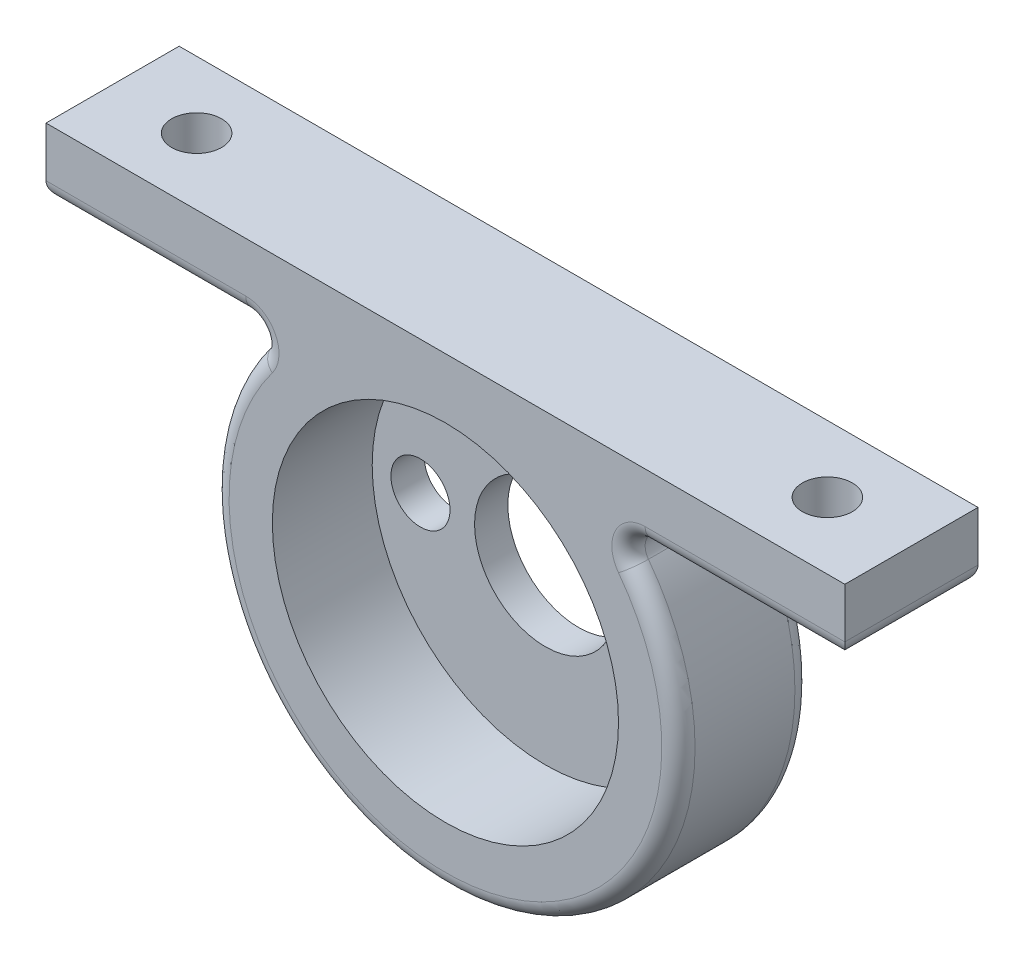
ISO-10303-21;
HEADER;
FILE_DESCRIPTION(('STEP AP214'),'2;1');
FILE_NAME('part.step','',(''),(''),'','','');
FILE_SCHEMA(('AUTOMOTIVE_DESIGN { 1 0 10303 214 1 1 1 1 }'));
ENDSEC;
DATA;
#1=APPLICATION_CONTEXT('core data for automotive mechanical design processes');
#2=APPLICATION_PROTOCOL_DEFINITION('international standard','automotive_design',2000,#1);
#3=PRODUCT_CONTEXT('',#1,'mechanical');
#4=PRODUCT('Part','Part','',(#3));
#5=PRODUCT_RELATED_PRODUCT_CATEGORY('part','',(#4));
#6=PRODUCT_DEFINITION_FORMATION('','',#4);
#7=PRODUCT_DEFINITION_CONTEXT('part definition',#1,'design');
#8=PRODUCT_DEFINITION('design','',#6,#7);
#9=PRODUCT_DEFINITION_SHAPE('','',#8);
#10=(LENGTH_UNIT() NAMED_UNIT(*) SI_UNIT(.MILLI.,.METRE.));
#11=(NAMED_UNIT(*) PLANE_ANGLE_UNIT() SI_UNIT($,.RADIAN.));
#12=(NAMED_UNIT(*) SI_UNIT($,.STERADIAN.) SOLID_ANGLE_UNIT());
#13=UNCERTAINTY_MEASURE_WITH_UNIT(LENGTH_MEASURE(1.E-05),#10,'distance_accuracy_value','');
#14=(GEOMETRIC_REPRESENTATION_CONTEXT(3) GLOBAL_UNCERTAINTY_ASSIGNED_CONTEXT((#13)) GLOBAL_UNIT_ASSIGNED_CONTEXT((#10,
#11,#12)) REPRESENTATION_CONTEXT('',''));
#15=CARTESIAN_POINT('',(0.,0.,0.));
#16=DIRECTION('',(0.,0.,1.));
#17=DIRECTION('',(1.,0.,0.));
#18=AXIS2_PLACEMENT_3D('',#15,#16,#17);
#19=CARTESIAN_POINT('',(0.,0.,8.));
#20=DIRECTION('',(0.,0.,-1.));
#21=DIRECTION('',(-1.,0.,0.));
#22=AXIS2_PLACEMENT_3D('',#19,#20,#21);
#23=CYLINDRICAL_SURFACE('',#22,14.);
#24=CARTESIAN_POINT('',(0.,0.,7.));
#25=DIRECTION('',(0.,0.,1.));
#26=DIRECTION('',(1.,0.,0.));
#27=AXIS2_PLACEMENT_3D('',#24,#25,#26);
#28=CIRCLE('',#27,14.);
#29=CARTESIAN_POINT('',(11.2,8.4,7.));
#30=VERTEX_POINT('',#29);
#31=CARTESIAN_POINT('',(-11.2,8.4,7.));
#32=VERTEX_POINT('',#31);
#33=EDGE_CURVE('E52',#30,#32,#28,.F.);
#34=ORIENTED_EDGE('',*,*,#33,.T.);
#35=DIRECTION('',(0.,0.,-1.));
#36=VECTOR('',#35,1.);
#37=CARTESIAN_POINT('',(-11.2,8.4,8.));
#38=LINE('',#37,#36);
#39=CARTESIAN_POINT('',(-11.2,8.4,1.));
#40=VERTEX_POINT('',#39);
#41=EDGE_CURVE('E207',#32,#40,#38,.T.);
#42=ORIENTED_EDGE('',*,*,#41,.T.);
#43=CARTESIAN_POINT('',(0.,0.,1.));
#44=DIRECTION('',(0.,0.,1.));
#45=DIRECTION('',(1.,0.,0.));
#46=AXIS2_PLACEMENT_3D('',#43,#44,#45);
#47=CIRCLE('',#46,14.);
#48=CARTESIAN_POINT('',(11.2,8.4,1.));
#49=VERTEX_POINT('',#48);
#50=EDGE_CURVE('E203',#40,#49,#47,.T.);
#51=ORIENTED_EDGE('',*,*,#50,.T.);
#52=DIRECTION('',(0.,0.,-1.));
#53=VECTOR('',#52,1.);
#54=CARTESIAN_POINT('',(11.2,8.4,8.));
#55=LINE('',#54,#53);
#56=EDGE_CURVE('E57',#49,#30,#55,.F.);
#57=ORIENTED_EDGE('',*,*,#56,.T.);
#58=EDGE_LOOP('',(#34,#42,#51,#57));
#59=FACE_BOUND('',#58,.T.);
#60=ADVANCED_FACE('F35',(#59),#23,.T.);
#61=CARTESIAN_POINT('',(24.,10.,8.));
#62=DIRECTION('',(0.,1.,0.));
#63=DIRECTION('',(-1.,0.,0.));
#64=AXIS2_PLACEMENT_3D('',#61,#62,#63);
#65=PLANE('',#64);
#66=CARTESIAN_POINT('',(18.9494897427832,10.,4.));
#67=DIRECTION('',(0.,-1.,0.));
#68=DIRECTION('',(0.,0.,-1.));
#69=AXIS2_PLACEMENT_3D('',#66,#67,#68);
#70=CIRCLE('',#69,1.5);
#71=CARTESIAN_POINT('',(18.9494897427832,10.,2.5));
#72=VERTEX_POINT('',#71);
#73=EDGE_CURVE('E279',#72,#72,#70,.T.);
#74=ORIENTED_EDGE('',*,*,#73,.F.);
#75=EDGE_LOOP('',(#74));
#76=FACE_BOUND('',#75,.T.);
#77=DIRECTION('',(1.,0.,0.));
#78=VECTOR('',#77,1.);
#79=CARTESIAN_POINT('',(9.79795897113272,9.99999999999999,7.));
#80=LINE('',#79,#78);
#81=CARTESIAN_POINT('',(23.,10.,7.));
#82=VERTEX_POINT('',#81);
#83=CARTESIAN_POINT('',(12.,9.99999999999999,7.));
#84=VERTEX_POINT('',#83);
#85=EDGE_CURVE('E198',#82,#84,#80,.F.);
#86=ORIENTED_EDGE('',*,*,#85,.T.);
#87=DIRECTION('',(0.,0.,1.));
#88=VECTOR('',#87,1.);
#89=CARTESIAN_POINT('',(12.,9.99999999999999,0.));
#90=LINE('',#89,#88);
#91=CARTESIAN_POINT('',(12.,9.99999999999999,1.));
#92=VERTEX_POINT('',#91);
#93=EDGE_CURVE('E201',#84,#92,#90,.F.);
#94=ORIENTED_EDGE('',*,*,#93,.T.);
#95=DIRECTION('',(1.,0.,0.));
#96=VECTOR('',#95,1.);
#97=CARTESIAN_POINT('',(24.,10.,1.));
#98=LINE('',#97,#96);
#99=CARTESIAN_POINT('',(23.,10.,1.));
#100=VERTEX_POINT('',#99);
#101=EDGE_CURVE('E196',#92,#100,#98,.T.);
#102=ORIENTED_EDGE('',*,*,#101,.T.);
#103=DIRECTION('',(0.,0.,-1.));
#104=VECTOR('',#103,1.);
#105=CARTESIAN_POINT('',(23.,10.,8.));
#106=LINE('',#105,#104);
#107=EDGE_CURVE('E194',#100,#82,#106,.F.);
#108=ORIENTED_EDGE('',*,*,#107,.T.);
#109=EDGE_LOOP('',(#86,#94,#102,#108));
#110=FACE_BOUND('',#109,.T.);
#111=ADVANCED_FACE('F342',(#76,#110),#65,.F.);
#112=CARTESIAN_POINT('',(24.,14.,8.));
#113=DIRECTION('',(-1.,0.,0.));
#114=DIRECTION('',(0.,0.,1.));
#115=AXIS2_PLACEMENT_3D('',#112,#113,#114);
#116=PLANE('',#115);
#117=DIRECTION('',(0.,1.,0.));
#118=VECTOR('',#117,1.);
#119=CARTESIAN_POINT('',(24.,14.,8.));
#120=LINE('',#119,#118);
#121=CARTESIAN_POINT('',(24.,11.,8.));
#122=VERTEX_POINT('',#121);
#123=CARTESIAN_POINT('',(24.,14.,8.));
#124=VERTEX_POINT('',#123);
#125=EDGE_CURVE('E136',#122,#124,#120,.T.);
#126=ORIENTED_EDGE('',*,*,#125,.F.);
#127=DIRECTION('',(0.,0.,-1.));
#128=VECTOR('',#127,1.);
#129=CARTESIAN_POINT('',(24.,11.,8.));
#130=LINE('',#129,#128);
#131=CARTESIAN_POINT('',(24.,11.,0.));
#132=VERTEX_POINT('',#131);
#133=EDGE_CURVE('E209',#122,#132,#130,.T.);
#134=ORIENTED_EDGE('',*,*,#133,.T.);
#135=DIRECTION('',(0.,1.,0.));
#136=VECTOR('',#135,1.);
#137=CARTESIAN_POINT('',(24.,14.,0.));
#138=LINE('',#137,#136);
#139=CARTESIAN_POINT('',(24.,14.,0.));
#140=VERTEX_POINT('',#139);
#141=EDGE_CURVE('E153',#132,#140,#138,.T.);
#142=ORIENTED_EDGE('',*,*,#141,.T.);
#143=DIRECTION('',(0.,0.,-1.));
#144=VECTOR('',#143,1.);
#145=CARTESIAN_POINT('',(24.,14.,8.));
#146=LINE('',#145,#144);
#147=EDGE_CURVE('E150',#124,#140,#146,.T.);
#148=ORIENTED_EDGE('',*,*,#147,.F.);
#149=EDGE_LOOP('',(#126,#134,#142,#148));
#150=FACE_BOUND('',#149,.T.);
#151=ADVANCED_FACE('F151',(#150),#116,.F.);
#152=CARTESIAN_POINT('',(0.,14.,8.));
#153=DIRECTION('',(0.,-1.,0.));
#154=DIRECTION('',(1.,0.,0.));
#155=AXIS2_PLACEMENT_3D('',#152,#153,#154);
#156=PLANE('',#155);
#157=CARTESIAN_POINT('',(18.9494897427832,14.,4.));
#158=DIRECTION('',(0.,-1.,0.));
#159=DIRECTION('',(0.,0.,-1.));
#160=AXIS2_PLACEMENT_3D('',#157,#158,#159);
#161=CIRCLE('',#160,1.5);
#162=CARTESIAN_POINT('',(18.9494897427832,14.,2.5));
#163=VERTEX_POINT('',#162);
#164=EDGE_CURVE('E283',#163,#163,#161,.T.);
#165=ORIENTED_EDGE('',*,*,#164,.T.);
#166=EDGE_LOOP('',(#165));
#167=FACE_BOUND('',#166,.T.);
#168=CARTESIAN_POINT('',(-18.9494897427832,14.,4.));
#169=DIRECTION('',(0.,-1.,0.));
#170=DIRECTION('',(0.,0.,-1.));
#171=AXIS2_PLACEMENT_3D('',#168,#169,#170);
#172=CIRCLE('',#171,1.5);
#173=CARTESIAN_POINT('',(-18.9494897427832,14.,2.5));
#174=VERTEX_POINT('',#173);
#175=EDGE_CURVE('E221',#174,#174,#172,.T.);
#176=ORIENTED_EDGE('',*,*,#175,.T.);
#177=EDGE_LOOP('',(#176));
#178=FACE_BOUND('',#177,.T.);
#179=DIRECTION('',(-1.,0.,0.));
#180=VECTOR('',#179,1.);
#181=CARTESIAN_POINT('',(0.,14.,0.));
#182=LINE('',#181,#180);
#183=CARTESIAN_POINT('',(-24.,14.,0.));
#184=VERTEX_POINT('',#183);
#185=EDGE_CURVE('E168',#140,#184,#182,.T.);
#186=ORIENTED_EDGE('',*,*,#185,.T.);
#187=DIRECTION('',(0.,0.,-1.));
#188=VECTOR('',#187,1.);
#189=CARTESIAN_POINT('',(-24.,14.,8.));
#190=LINE('',#189,#188);
#191=CARTESIAN_POINT('',(-24.,14.,8.));
#192=VERTEX_POINT('',#191);
#193=EDGE_CURVE('E157',#192,#184,#190,.T.);
#194=ORIENTED_EDGE('',*,*,#193,.F.);
#195=DIRECTION('',(-1.,0.,0.));
#196=VECTOR('',#195,1.);
#197=CARTESIAN_POINT('',(0.,14.,8.));
#198=LINE('',#197,#196);
#199=EDGE_CURVE('E141',#124,#192,#198,.T.);
#200=ORIENTED_EDGE('',*,*,#199,.F.);
#201=ORIENTED_EDGE('',*,*,#147,.T.);
#202=EDGE_LOOP('',(#186,#194,#200,#201));
#203=FACE_BOUND('',#202,.T.);
#204=ADVANCED_FACE('F159',(#167,#178,#203),#156,.F.);
#205=CARTESIAN_POINT('',(-24.,14.,8.));
#206=DIRECTION('',(1.,0.,0.));
#207=DIRECTION('',(0.,0.,-1.));
#208=AXIS2_PLACEMENT_3D('',#205,#206,#207);
#209=PLANE('',#208);
#210=DIRECTION('',(0.,-1.,0.));
#211=VECTOR('',#210,1.);
#212=CARTESIAN_POINT('',(-24.,14.,0.));
#213=LINE('',#212,#211);
#214=CARTESIAN_POINT('',(-24.,11.,0.));
#215=VERTEX_POINT('',#214);
#216=EDGE_CURVE('E147',#184,#215,#213,.T.);
#217=ORIENTED_EDGE('',*,*,#216,.T.);
#218=DIRECTION('',(0.,0.,-1.));
#219=VECTOR('',#218,1.);
#220=CARTESIAN_POINT('',(-24.,11.,8.));
#221=LINE('',#220,#219);
#222=CARTESIAN_POINT('',(-24.,11.,8.));
#223=VERTEX_POINT('',#222);
#224=EDGE_CURVE('E211',#215,#223,#221,.F.);
#225=ORIENTED_EDGE('',*,*,#224,.T.);
#226=DIRECTION('',(0.,-1.,0.));
#227=VECTOR('',#226,1.);
#228=CARTESIAN_POINT('',(-24.,14.,8.));
#229=LINE('',#228,#227);
#230=EDGE_CURVE('E162',#192,#223,#229,.T.);
#231=ORIENTED_EDGE('',*,*,#230,.F.);
#232=ORIENTED_EDGE('',*,*,#193,.T.);
#233=EDGE_LOOP('',(#217,#225,#231,#232));
#234=FACE_BOUND('',#233,.T.);
#235=ADVANCED_FACE('F298',(#234),#209,.F.);
#236=CARTESIAN_POINT('',(-24.,10.,8.));
#237=DIRECTION('',(0.,1.,0.));
#238=DIRECTION('',(0.,0.,1.));
#239=AXIS2_PLACEMENT_3D('',#236,#237,#238);
#240=PLANE('',#239);
#241=CARTESIAN_POINT('',(-18.9494897427832,10.,4.));
#242=DIRECTION('',(0.,-1.,0.));
#243=DIRECTION('',(0.,0.,-1.));
#244=AXIS2_PLACEMENT_3D('',#241,#242,#243);
#245=CIRCLE('',#244,1.5);
#246=CARTESIAN_POINT('',(-18.9494897427832,10.,2.5));
#247=VERTEX_POINT('',#246);
#248=EDGE_CURVE('E286',#247,#247,#245,.T.);
#249=ORIENTED_EDGE('',*,*,#248,.F.);
#250=EDGE_LOOP('',(#249));
#251=FACE_BOUND('',#250,.T.);
#252=DIRECTION('',(1.,0.,0.));
#253=VECTOR('',#252,1.);
#254=CARTESIAN_POINT('',(-24.,10.,1.));
#255=LINE('',#254,#253);
#256=CARTESIAN_POINT('',(-23.,10.,1.));
#257=VERTEX_POINT('',#256);
#258=CARTESIAN_POINT('',(-12.,10.,1.));
#259=VERTEX_POINT('',#258);
#260=EDGE_CURVE('E181',#257,#259,#255,.T.);
#261=ORIENTED_EDGE('',*,*,#260,.T.);
#262=DIRECTION('',(0.,0.,1.));
#263=VECTOR('',#262,1.);
#264=CARTESIAN_POINT('',(-12.,10.,8.));
#265=LINE('',#264,#263);
#266=CARTESIAN_POINT('',(-12.,10.,7.));
#267=VERTEX_POINT('',#266);
#268=EDGE_CURVE('E186',#259,#267,#265,.T.);
#269=ORIENTED_EDGE('',*,*,#268,.T.);
#270=DIRECTION('',(1.,0.,0.));
#271=VECTOR('',#270,1.);
#272=CARTESIAN_POINT('',(-24.,10.,7.));
#273=LINE('',#272,#271);
#274=CARTESIAN_POINT('',(-23.,10.,7.));
#275=VERTEX_POINT('',#274);
#276=EDGE_CURVE('E183',#267,#275,#273,.F.);
#277=ORIENTED_EDGE('',*,*,#276,.T.);
#278=DIRECTION('',(0.,0.,-1.));
#279=VECTOR('',#278,1.);
#280=CARTESIAN_POINT('',(-23.,10.,8.));
#281=LINE('',#280,#279);
#282=EDGE_CURVE('E179',#275,#257,#281,.T.);
#283=ORIENTED_EDGE('',*,*,#282,.T.);
#284=EDGE_LOOP('',(#261,#269,#277,#283));
#285=FACE_BOUND('',#284,.T.);
#286=ADVANCED_FACE('F295',(#251,#285),#240,.F.);
#287=CARTESIAN_POINT('',(0.,0.,8.));
#288=DIRECTION('',(0.,0.,1.));
#289=DIRECTION('',(1.,0.,0.));
#290=AXIS2_PLACEMENT_3D('',#287,#288,#289);
#291=PLANE('',#290);
#292=CARTESIAN_POINT('',(0.,0.,8.));
#293=DIRECTION('',(0.,0.,1.));
#294=DIRECTION('',(1.,0.,0.));
#295=AXIS2_PLACEMENT_3D('',#292,#293,#294);
#296=CIRCLE('',#295,10.4);
#297=CARTESIAN_POINT('',(10.4,0.,8.));
#298=VERTEX_POINT('',#297);
#299=EDGE_CURVE('E270',#298,#298,#296,.T.);
#300=ORIENTED_EDGE('',*,*,#299,.F.);
#301=EDGE_LOOP('',(#300));
#302=FACE_BOUND('',#301,.T.);
#303=CARTESIAN_POINT('',(0.,0.,8.));
#304=DIRECTION('',(0.,0.,1.));
#305=DIRECTION('',(1.,0.,0.));
#306=AXIS2_PLACEMENT_3D('',#303,#304,#305);
#307=CIRCLE('',#306,13.);
#308=CARTESIAN_POINT('',(-10.4,7.8,8.));
#309=VERTEX_POINT('',#308);
#310=CARTESIAN_POINT('',(10.4,7.8,8.));
#311=VERTEX_POINT('',#310);
#312=EDGE_CURVE('E156',#309,#311,#307,.T.);
#313=ORIENTED_EDGE('',*,*,#312,.T.);
#314=CARTESIAN_POINT('',(12.,9.,8.));
#315=DIRECTION('',(0.,0.,1.));
#316=DIRECTION('',(1.,0.,0.));
#317=AXIS2_PLACEMENT_3D('',#314,#315,#316);
#318=CIRCLE('',#317,2.);
#319=CARTESIAN_POINT('',(12.,11.,8.));
#320=VERTEX_POINT('',#319);
#321=EDGE_CURVE('E44',#311,#320,#318,.F.);
#322=ORIENTED_EDGE('',*,*,#321,.T.);
#323=DIRECTION('',(1.,0.,0.));
#324=VECTOR('',#323,1.);
#325=CARTESIAN_POINT('',(24.,11.,8.));
#326=LINE('',#325,#324);
#327=EDGE_CURVE('E144',#320,#122,#326,.T.);
#328=ORIENTED_EDGE('',*,*,#327,.T.);
#329=ORIENTED_EDGE('',*,*,#125,.T.);
#330=ORIENTED_EDGE('',*,*,#199,.T.);
#331=ORIENTED_EDGE('',*,*,#230,.T.);
#332=DIRECTION('',(1.,0.,0.));
#333=VECTOR('',#332,1.);
#334=CARTESIAN_POINT('',(-9.79795897113272,11.,8.));
#335=LINE('',#334,#333);
#336=CARTESIAN_POINT('',(-12.,11.,8.));
#337=VERTEX_POINT('',#336);
#338=EDGE_CURVE('E176',#223,#337,#335,.T.);
#339=ORIENTED_EDGE('',*,*,#338,.T.);
#340=CARTESIAN_POINT('',(-12.,9.,8.));
#341=DIRECTION('',(0.,0.,1.));
#342=DIRECTION('',(1.,0.,0.));
#343=AXIS2_PLACEMENT_3D('',#340,#341,#342);
#344=CIRCLE('',#343,2.);
#345=EDGE_CURVE('E213',#337,#309,#344,.F.);
#346=ORIENTED_EDGE('',*,*,#345,.T.);
#347=EDGE_LOOP('',(#313,#322,#328,#329,#330,#331,#339,#346));
#348=FACE_BOUND('',#347,.T.);
#349=ADVANCED_FACE('F138',(#302,#348),#291,.T.);
#350=CARTESIAN_POINT('',(0.,0.,0.));
#351=DIRECTION('',(0.,0.,1.));
#352=DIRECTION('',(1.,0.,0.));
#353=AXIS2_PLACEMENT_3D('',#350,#351,#352);
#354=PLANE('',#353);
#355=CARTESIAN_POINT('',(7.5,0.,0.));
#356=DIRECTION('',(0.,0.,-1.));
#357=DIRECTION('',(-1.,0.,0.));
#358=AXIS2_PLACEMENT_3D('',#355,#356,#357);
#359=CIRCLE('',#358,1.775);
#360=CARTESIAN_POINT('',(5.725,0.,0.));
#361=VERTEX_POINT('',#360);
#362=EDGE_CURVE('E630',#361,#361,#359,.T.);
#363=ORIENTED_EDGE('',*,*,#362,.F.);
#364=EDGE_LOOP('',(#363));
#365=FACE_BOUND('',#364,.T.);
#366=CARTESIAN_POINT('',(-7.5,0.,0.));
#367=DIRECTION('',(0.,0.,-1.));
#368=DIRECTION('',(-1.,0.,0.));
#369=AXIS2_PLACEMENT_3D('',#366,#367,#368);
#370=CIRCLE('',#369,1.775);
#371=CARTESIAN_POINT('',(-9.275,0.,0.));
#372=VERTEX_POINT('',#371);
#373=EDGE_CURVE('E631',#372,#372,#370,.T.);
#374=ORIENTED_EDGE('',*,*,#373,.F.);
#375=EDGE_LOOP('',(#374));
#376=FACE_BOUND('',#375,.T.);
#377=CARTESIAN_POINT('',(0.,0.,0.));
#378=DIRECTION('',(0.,0.,-1.));
#379=DIRECTION('',(-1.,0.,0.));
#380=AXIS2_PLACEMENT_3D('',#377,#378,#379);
#381=CIRCLE('',#380,4.25);
#382=CARTESIAN_POINT('',(-4.25,0.,0.));
#383=VERTEX_POINT('',#382);
#384=EDGE_CURVE('E265',#383,#383,#381,.T.);
#385=ORIENTED_EDGE('',*,*,#384,.F.);
#386=EDGE_LOOP('',(#385));
#387=FACE_BOUND('',#386,.T.);
#388=CARTESIAN_POINT('',(0.,0.,0.));
#389=DIRECTION('',(0.,0.,1.));
#390=DIRECTION('',(1.,0.,0.));
#391=AXIS2_PLACEMENT_3D('',#388,#389,#390);
#392=CIRCLE('',#391,13.);
#393=CARTESIAN_POINT('',(10.4,7.8,0.));
#394=VERTEX_POINT('',#393);
#395=CARTESIAN_POINT('',(-10.4,7.8,0.));
#396=VERTEX_POINT('',#395);
#397=EDGE_CURVE('E188',#394,#396,#392,.F.);
#398=ORIENTED_EDGE('',*,*,#397,.T.);
#399=CARTESIAN_POINT('',(-12.,9.,0.));
#400=DIRECTION('',(0.,0.,1.));
#401=DIRECTION('',(1.,0.,0.));
#402=AXIS2_PLACEMENT_3D('',#399,#400,#401);
#403=CIRCLE('',#402,2.);
#404=CARTESIAN_POINT('',(-12.,11.,0.));
#405=VERTEX_POINT('',#404);
#406=EDGE_CURVE('E11',#396,#405,#403,.T.);
#407=ORIENTED_EDGE('',*,*,#406,.T.);
#408=DIRECTION('',(1.,0.,0.));
#409=VECTOR('',#408,1.);
#410=CARTESIAN_POINT('',(0.,11.,0.));
#411=LINE('',#410,#409);
#412=EDGE_CURVE('E192',#405,#215,#411,.F.);
#413=ORIENTED_EDGE('',*,*,#412,.T.);
#414=ORIENTED_EDGE('',*,*,#216,.F.);
#415=ORIENTED_EDGE('',*,*,#185,.F.);
#416=ORIENTED_EDGE('',*,*,#141,.F.);
#417=DIRECTION('',(1.,0.,0.));
#418=VECTOR('',#417,1.);
#419=CARTESIAN_POINT('',(0.,11.,0.));
#420=LINE('',#419,#418);
#421=CARTESIAN_POINT('',(12.,11.,0.));
#422=VERTEX_POINT('',#421);
#423=EDGE_CURVE('E190',#132,#422,#420,.F.);
#424=ORIENTED_EDGE('',*,*,#423,.T.);
#425=CARTESIAN_POINT('',(12.,9.,0.));
#426=DIRECTION('',(0.,0.,1.));
#427=DIRECTION('',(1.,0.,0.));
#428=AXIS2_PLACEMENT_3D('',#425,#426,#427);
#429=CIRCLE('',#428,2.);
#430=EDGE_CURVE('E215',#422,#394,#429,.T.);
#431=ORIENTED_EDGE('',*,*,#430,.T.);
#432=EDGE_LOOP('',(#398,#407,#413,#414,#415,#416,#424,#431));
#433=FACE_BOUND('',#432,.T.);
#434=ADVANCED_FACE('F334',(#365,#376,#387,#433),#354,.F.);
#435=CARTESIAN_POINT('',(24.,11.,1.));
#436=DIRECTION('',(1.,0.,0.));
#437=DIRECTION('',(0.,1.,0.));
#438=AXIS2_PLACEMENT_3D('',#435,#436,#437);
#439=CYLINDRICAL_SURFACE('',#438,1.);
#440=CARTESIAN_POINT('',(12.,11.,1.));
#441=DIRECTION('',(-1.,0.,0.));
#442=DIRECTION('',(0.,0.,1.));
#443=AXIS2_PLACEMENT_3D('',#440,#441,#442);
#444=CIRCLE('',#443,1.);
#445=EDGE_CURVE('E257',#422,#92,#444,.T.);
#446=ORIENTED_EDGE('',*,*,#445,.F.);
#447=ORIENTED_EDGE('',*,*,#423,.F.);
#448=CARTESIAN_POINT('',(23.,11.,1.));
#449=DIRECTION('',(-0.707106781186547,0.,-0.707106781186547));
#450=DIRECTION('',(0.707106781186547,0.,-0.707106781186547));
#451=AXIS2_PLACEMENT_3D('',#448,#449,#450);
#452=ELLIPSE('',#451,1.41421356237309,1.);
#453=EDGE_CURVE('E169',#100,#132,#452,.F.);
#454=ORIENTED_EDGE('',*,*,#453,.F.);
#455=ORIENTED_EDGE('',*,*,#101,.F.);
#456=EDGE_LOOP('',(#446,#447,#454,#455));
#457=FACE_BOUND('',#456,.T.);
#458=ADVANCED_FACE('F37',(#457),#439,.T.);
#459=CARTESIAN_POINT('',(23.,11.,8.));
#460=DIRECTION('',(0.,0.,-1.));
#461=DIRECTION('',(-1.,0.,0.));
#462=AXIS2_PLACEMENT_3D('',#459,#460,#461);
#463=CYLINDRICAL_SURFACE('',#462,1.);
#464=ORIENTED_EDGE('',*,*,#453,.T.);
#465=ORIENTED_EDGE('',*,*,#133,.F.);
#466=CARTESIAN_POINT('',(23.,11.,7.));
#467=DIRECTION('',(0.707106781186547,0.,-0.707106781186547));
#468=DIRECTION('',(-0.707106781186547,0.,-0.707106781186547));
#469=AXIS2_PLACEMENT_3D('',#466,#467,#468);
#470=ELLIPSE('',#469,1.41421356237309,1.);
#471=EDGE_CURVE('E254',#82,#122,#470,.F.);
#472=ORIENTED_EDGE('',*,*,#471,.F.);
#473=ORIENTED_EDGE('',*,*,#107,.F.);
#474=EDGE_LOOP('',(#464,#465,#472,#473));
#475=FACE_BOUND('',#474,.T.);
#476=ADVANCED_FACE('F383',(#475),#463,.T.);
#477=CARTESIAN_POINT('',(12.,9.,1.));
#478=DIRECTION('',(0.,0.,1.));
#479=DIRECTION('',(1.,0.,0.));
#480=AXIS2_PLACEMENT_3D('',#477,#478,#479);
#481=TOROIDAL_SURFACE('',#480,2.,1.);
#482=ORIENTED_EDGE('',*,*,#430,.F.);
#483=ORIENTED_EDGE('',*,*,#445,.T.);
#484=CARTESIAN_POINT('',(12.,9.,1.));
#485=DIRECTION('',(0.,0.,1.));
#486=DIRECTION('',(1.,0.,0.));
#487=AXIS2_PLACEMENT_3D('',#484,#485,#486);
#488=CIRCLE('',#487,1.);
#489=EDGE_CURVE('E251',#49,#92,#488,.F.);
#490=ORIENTED_EDGE('',*,*,#489,.F.);
#491=CARTESIAN_POINT('',(10.4,7.8,1.));
#492=DIRECTION('',(-0.6,0.8,0.));
#493=DIRECTION('',(-0.8,-0.6,0.));
#494=AXIS2_PLACEMENT_3D('',#491,#492,#493);
#495=CIRCLE('',#494,1.);
#496=EDGE_CURVE('E248',#394,#49,#495,.F.);
#497=ORIENTED_EDGE('',*,*,#496,.F.);
#498=EDGE_LOOP('',(#482,#483,#490,#497));
#499=FACE_BOUND('',#498,.T.);
#500=ADVANCED_FACE('F380',(#499),#481,.T.);
#501=CARTESIAN_POINT('',(0.,11.,7.));
#502=DIRECTION('',(-1.,0.,0.));
#503=DIRECTION('',(0.,-1.,0.));
#504=AXIS2_PLACEMENT_3D('',#501,#502,#503);
#505=CYLINDRICAL_SURFACE('',#504,1.);
#506=ORIENTED_EDGE('',*,*,#471,.T.);
#507=ORIENTED_EDGE('',*,*,#327,.F.);
#508=CARTESIAN_POINT('',(12.,11.,7.));
#509=DIRECTION('',(-1.,0.,0.));
#510=DIRECTION('',(0.,0.,1.));
#511=AXIS2_PLACEMENT_3D('',#508,#509,#510);
#512=CIRCLE('',#511,1.);
#513=EDGE_CURVE('E245',#84,#320,#512,.T.);
#514=ORIENTED_EDGE('',*,*,#513,.F.);
#515=ORIENTED_EDGE('',*,*,#85,.F.);
#516=EDGE_LOOP('',(#506,#507,#514,#515));
#517=FACE_BOUND('',#516,.T.);
#518=ADVANCED_FACE('F376',(#517),#505,.T.);
#519=CARTESIAN_POINT('',(12.,9.,8.));
#520=DIRECTION('',(0.,0.,-1.));
#521=DIRECTION('',(-1.,0.,0.));
#522=AXIS2_PLACEMENT_3D('',#519,#520,#521);
#523=CYLINDRICAL_SURFACE('',#522,1.);
#524=ORIENTED_EDGE('',*,*,#489,.T.);
#525=ORIENTED_EDGE('',*,*,#93,.F.);
#526=CARTESIAN_POINT('',(12.,9.,7.));
#527=DIRECTION('',(0.,0.,1.));
#528=DIRECTION('',(1.,0.,0.));
#529=AXIS2_PLACEMENT_3D('',#526,#527,#528);
#530=CIRCLE('',#529,1.);
#531=EDGE_CURVE('E243',#30,#84,#530,.F.);
#532=ORIENTED_EDGE('',*,*,#531,.F.);
#533=ORIENTED_EDGE('',*,*,#56,.F.);
#534=EDGE_LOOP('',(#524,#525,#532,#533));
#535=FACE_BOUND('',#534,.T.);
#536=ADVANCED_FACE('F373',(#535),#523,.F.);
#537=CARTESIAN_POINT('',(0.,0.,1.));
#538=DIRECTION('',(0.,0.,1.));
#539=DIRECTION('',(1.,0.,0.));
#540=AXIS2_PLACEMENT_3D('',#537,#538,#539);
#541=TOROIDAL_SURFACE('',#540,13.,1.);
#542=ORIENTED_EDGE('',*,*,#496,.T.);
#543=ORIENTED_EDGE('',*,*,#50,.F.);
#544=CARTESIAN_POINT('',(-10.4,7.8,1.));
#545=DIRECTION('',(0.6,0.8,0.));
#546=DIRECTION('',(-0.8,0.6,0.));
#547=AXIS2_PLACEMENT_3D('',#544,#545,#546);
#548=CIRCLE('',#547,1.);
#549=EDGE_CURVE('E240',#396,#40,#548,.T.);
#550=ORIENTED_EDGE('',*,*,#549,.F.);
#551=ORIENTED_EDGE('',*,*,#397,.F.);
#552=EDGE_LOOP('',(#542,#543,#550,#551));
#553=FACE_BOUND('',#552,.T.);
#554=ADVANCED_FACE('F339',(#553),#541,.T.);
#555=CARTESIAN_POINT('',(12.,9.,7.));
#556=DIRECTION('',(0.,0.,1.));
#557=DIRECTION('',(1.,0.,0.));
#558=AXIS2_PLACEMENT_3D('',#555,#556,#557);
#559=TOROIDAL_SURFACE('',#558,2.,1.);
#560=ORIENTED_EDGE('',*,*,#513,.T.);
#561=ORIENTED_EDGE('',*,*,#321,.F.);
#562=CARTESIAN_POINT('',(10.4,7.8,7.));
#563=DIRECTION('',(-0.6,0.8,0.));
#564=DIRECTION('',(-0.8,-0.6,0.));
#565=AXIS2_PLACEMENT_3D('',#562,#563,#564);
#566=CIRCLE('',#565,1.);
#567=EDGE_CURVE('E234',#30,#311,#566,.F.);
#568=ORIENTED_EDGE('',*,*,#567,.F.);
#569=ORIENTED_EDGE('',*,*,#531,.T.);
#570=EDGE_LOOP('',(#560,#561,#568,#569));
#571=FACE_BOUND('',#570,.T.);
#572=ADVANCED_FACE('F367',(#571),#559,.T.);
#573=CARTESIAN_POINT('',(-12.,9.,1.));
#574=DIRECTION('',(0.,0.,1.));
#575=DIRECTION('',(1.,0.,0.));
#576=AXIS2_PLACEMENT_3D('',#573,#574,#575);
#577=TOROIDAL_SURFACE('',#576,2.,1.);
#578=CARTESIAN_POINT('',(-12.,9.,1.));
#579=DIRECTION('',(0.,0.,1.));
#580=DIRECTION('',(1.,0.,0.));
#581=AXIS2_PLACEMENT_3D('',#578,#579,#580);
#582=CIRCLE('',#581,1.);
#583=EDGE_CURVE('E232',#259,#40,#582,.F.);
#584=ORIENTED_EDGE('',*,*,#583,.F.);
#585=CARTESIAN_POINT('',(-12.,11.,1.));
#586=DIRECTION('',(1.,0.,0.));
#587=DIRECTION('',(0.,0.,-1.));
#588=AXIS2_PLACEMENT_3D('',#585,#586,#587);
#589=CIRCLE('',#588,1.);
#590=EDGE_CURVE('E237',#405,#259,#589,.F.);
#591=ORIENTED_EDGE('',*,*,#590,.F.);
#592=ORIENTED_EDGE('',*,*,#406,.F.);
#593=ORIENTED_EDGE('',*,*,#549,.T.);
#594=EDGE_LOOP('',(#584,#591,#592,#593));
#595=FACE_BOUND('',#594,.T.);
#596=ADVANCED_FACE('F312',(#595),#577,.T.);
#597=CARTESIAN_POINT('',(-24.,11.,1.));
#598=DIRECTION('',(1.,0.,0.));
#599=DIRECTION('',(0.,0.,-1.));
#600=AXIS2_PLACEMENT_3D('',#597,#598,#599);
#601=CYLINDRICAL_SURFACE('',#600,1.);
#602=ORIENTED_EDGE('',*,*,#590,.T.);
#603=ORIENTED_EDGE('',*,*,#260,.F.);
#604=CARTESIAN_POINT('',(-23.,11.,1.));
#605=DIRECTION('',(0.707106781186547,0.,-0.707106781186547));
#606=DIRECTION('',(-0.707106781186547,0.,-0.707106781186547));
#607=AXIS2_PLACEMENT_3D('',#604,#605,#606);
#608=ELLIPSE('',#607,1.41421356237309,1.);
#609=EDGE_CURVE('E229',#215,#257,#608,.F.);
#610=ORIENTED_EDGE('',*,*,#609,.F.);
#611=ORIENTED_EDGE('',*,*,#412,.F.);
#612=EDGE_LOOP('',(#602,#603,#610,#611));
#613=FACE_BOUND('',#612,.T.);
#614=ADVANCED_FACE('F309',(#613),#601,.T.);
#615=CARTESIAN_POINT('',(0.,0.,7.));
#616=DIRECTION('',(0.,0.,1.));
#617=DIRECTION('',(1.,0.,0.));
#618=AXIS2_PLACEMENT_3D('',#615,#616,#617);
#619=TOROIDAL_SURFACE('',#618,13.,1.);
#620=ORIENTED_EDGE('',*,*,#567,.T.);
#621=ORIENTED_EDGE('',*,*,#312,.F.);
#622=CARTESIAN_POINT('',(-10.4,7.8,7.));
#623=DIRECTION('',(0.6,0.8,0.));
#624=DIRECTION('',(-0.8,0.6,0.));
#625=AXIS2_PLACEMENT_3D('',#622,#623,#624);
#626=CIRCLE('',#625,1.);
#627=EDGE_CURVE('E226',#32,#309,#626,.T.);
#628=ORIENTED_EDGE('',*,*,#627,.F.);
#629=ORIENTED_EDGE('',*,*,#33,.F.);
#630=EDGE_LOOP('',(#620,#621,#628,#629));
#631=FACE_BOUND('',#630,.T.);
#632=ADVANCED_FACE('F359',(#631),#619,.T.);
#633=CARTESIAN_POINT('',(-12.,9.,8.));
#634=DIRECTION('',(0.,0.,-1.));
#635=DIRECTION('',(-1.,0.,0.));
#636=AXIS2_PLACEMENT_3D('',#633,#634,#635);
#637=CYLINDRICAL_SURFACE('',#636,1.);
#638=ORIENTED_EDGE('',*,*,#583,.T.);
#639=ORIENTED_EDGE('',*,*,#41,.F.);
#640=CARTESIAN_POINT('',(-12.,9.,7.));
#641=DIRECTION('',(0.,0.,1.));
#642=DIRECTION('',(1.,0.,0.));
#643=AXIS2_PLACEMENT_3D('',#640,#641,#642);
#644=CIRCLE('',#643,1.);
#645=EDGE_CURVE('E223',#267,#32,#644,.F.);
#646=ORIENTED_EDGE('',*,*,#645,.F.);
#647=ORIENTED_EDGE('',*,*,#268,.F.);
#648=EDGE_LOOP('',(#638,#639,#646,#647));
#649=FACE_BOUND('',#648,.T.);
#650=ADVANCED_FACE('F316',(#649),#637,.F.);
#651=CARTESIAN_POINT('',(-23.,11.,8.));
#652=DIRECTION('',(0.,0.,-1.));
#653=DIRECTION('',(-1.,0.,0.));
#654=AXIS2_PLACEMENT_3D('',#651,#652,#653);
#655=CYLINDRICAL_SURFACE('',#654,1.);
#656=ORIENTED_EDGE('',*,*,#609,.T.);
#657=ORIENTED_EDGE('',*,*,#282,.F.);
#658=CARTESIAN_POINT('',(-23.,11.,7.));
#659=DIRECTION('',(-0.707106781186547,0.,-0.707106781186547));
#660=DIRECTION('',(0.707106781186547,0.,-0.707106781186547));
#661=AXIS2_PLACEMENT_3D('',#658,#659,#660);
#662=ELLIPSE('',#661,1.41421356237309,1.);
#663=EDGE_CURVE('E220',#223,#275,#662,.F.);
#664=ORIENTED_EDGE('',*,*,#663,.F.);
#665=ORIENTED_EDGE('',*,*,#224,.F.);
#666=EDGE_LOOP('',(#656,#657,#664,#665));
#667=FACE_BOUND('',#666,.T.);
#668=ADVANCED_FACE('F331',(#667),#655,.T.);
#669=CARTESIAN_POINT('',(-12.,9.,7.));
#670=DIRECTION('',(0.,0.,1.));
#671=DIRECTION('',(1.,0.,0.));
#672=AXIS2_PLACEMENT_3D('',#669,#670,#671);
#673=TOROIDAL_SURFACE('',#672,2.,1.);
#674=ORIENTED_EDGE('',*,*,#627,.T.);
#675=ORIENTED_EDGE('',*,*,#345,.F.);
#676=CARTESIAN_POINT('',(-12.,11.,7.));
#677=DIRECTION('',(1.,0.,0.));
#678=DIRECTION('',(0.,0.,-1.));
#679=AXIS2_PLACEMENT_3D('',#676,#677,#678);
#680=CIRCLE('',#679,1.);
#681=EDGE_CURVE('E218',#267,#337,#680,.F.);
#682=ORIENTED_EDGE('',*,*,#681,.F.);
#683=ORIENTED_EDGE('',*,*,#645,.T.);
#684=EDGE_LOOP('',(#674,#675,#682,#683));
#685=FACE_BOUND('',#684,.T.);
#686=ADVANCED_FACE('F326',(#685),#673,.T.);
#687=CARTESIAN_POINT('',(0.,11.,7.));
#688=DIRECTION('',(-1.,0.,0.));
#689=DIRECTION('',(0.,0.,1.));
#690=AXIS2_PLACEMENT_3D('',#687,#688,#689);
#691=CYLINDRICAL_SURFACE('',#690,1.);
#692=ORIENTED_EDGE('',*,*,#663,.T.);
#693=ORIENTED_EDGE('',*,*,#276,.F.);
#694=ORIENTED_EDGE('',*,*,#681,.T.);
#695=ORIENTED_EDGE('',*,*,#338,.F.);
#696=EDGE_LOOP('',(#692,#693,#694,#695));
#697=FACE_BOUND('',#696,.T.);
#698=ADVANCED_FACE('F322',(#697),#691,.T.);
#699=CARTESIAN_POINT('',(-18.9494897427832,14.,4.));
#700=DIRECTION('',(0.,-1.,0.));
#701=DIRECTION('',(0.,0.,-1.));
#702=AXIS2_PLACEMENT_3D('',#699,#700,#701);
#703=CYLINDRICAL_SURFACE('',#702,1.5);
#704=ORIENTED_EDGE('',*,*,#175,.F.);
#705=EDGE_LOOP('',(#704));
#706=FACE_BOUND('',#705,.T.);
#707=ORIENTED_EDGE('',*,*,#248,.T.);
#708=EDGE_LOOP('',(#707));
#709=FACE_BOUND('',#708,.T.);
#710=ADVANCED_FACE('F293',(#706,#709),#703,.F.);
#711=CARTESIAN_POINT('',(18.9494897427832,14.,4.));
#712=DIRECTION('',(0.,-1.,0.));
#713=DIRECTION('',(0.,0.,-1.));
#714=AXIS2_PLACEMENT_3D('',#711,#712,#713);
#715=CYLINDRICAL_SURFACE('',#714,1.5);
#716=ORIENTED_EDGE('',*,*,#164,.F.);
#717=EDGE_LOOP('',(#716));
#718=FACE_BOUND('',#717,.T.);
#719=ORIENTED_EDGE('',*,*,#73,.T.);
#720=EDGE_LOOP('',(#719));
#721=FACE_BOUND('',#720,.T.);
#722=ADVANCED_FACE('F450',(#718,#721),#715,.F.);
#723=CARTESIAN_POINT('',(0.,0.,2.));
#724=DIRECTION('',(0.,0.,1.));
#725=DIRECTION('',(1.,0.,0.));
#726=AXIS2_PLACEMENT_3D('',#723,#724,#725);
#727=CYLINDRICAL_SURFACE('',#726,10.4);
#728=CARTESIAN_POINT('',(0.,0.,2.));
#729=DIRECTION('',(0.,0.,1.));
#730=DIRECTION('',(1.,0.,0.));
#731=AXIS2_PLACEMENT_3D('',#728,#729,#730);
#732=CIRCLE('',#731,10.4);
#733=CARTESIAN_POINT('',(10.4,0.,2.));
#734=VERTEX_POINT('',#733);
#735=EDGE_CURVE('E274',#734,#734,#732,.T.);
#736=ORIENTED_EDGE('',*,*,#735,.F.);
#737=EDGE_LOOP('',(#736));
#738=FACE_BOUND('',#737,.T.);
#739=ORIENTED_EDGE('',*,*,#299,.T.);
#740=EDGE_LOOP('',(#739));
#741=FACE_BOUND('',#740,.T.);
#742=ADVANCED_FACE('F454',(#738,#741),#727,.F.);
#743=CARTESIAN_POINT('',(0.,0.,2.));
#744=DIRECTION('',(0.,0.,1.));
#745=DIRECTION('',(1.,0.,0.));
#746=AXIS2_PLACEMENT_3D('',#743,#744,#745);
#747=PLANE('',#746);
#748=CARTESIAN_POINT('',(7.5,0.,2.));
#749=DIRECTION('',(0.,0.,1.));
#750=DIRECTION('',(1.,0.,0.));
#751=AXIS2_PLACEMENT_3D('',#748,#749,#750);
#752=CIRCLE('',#751,1.775);
#753=CARTESIAN_POINT('',(9.275,0.,2.));
#754=VERTEX_POINT('',#753);
#755=EDGE_CURVE('E39',#754,#754,#752,.T.);
#756=ORIENTED_EDGE('',*,*,#755,.F.);
#757=EDGE_LOOP('',(#756));
#758=FACE_BOUND('',#757,.T.);
#759=CARTESIAN_POINT('',(-7.5,0.,2.));
#760=DIRECTION('',(0.,0.,1.));
#761=DIRECTION('',(1.,0.,0.));
#762=AXIS2_PLACEMENT_3D('',#759,#760,#761);
#763=CIRCLE('',#762,1.775);
#764=CARTESIAN_POINT('',(-5.725,0.,2.));
#765=VERTEX_POINT('',#764);
#766=EDGE_CURVE('E264',#765,#765,#763,.T.);
#767=ORIENTED_EDGE('',*,*,#766,.F.);
#768=EDGE_LOOP('',(#767));
#769=FACE_BOUND('',#768,.T.);
#770=CARTESIAN_POINT('',(0.,0.,2.));
#771=DIRECTION('',(0.,0.,1.));
#772=DIRECTION('',(1.,0.,0.));
#773=AXIS2_PLACEMENT_3D('',#770,#771,#772);
#774=CIRCLE('',#773,4.25);
#775=CARTESIAN_POINT('',(4.25,0.,2.));
#776=VERTEX_POINT('',#775);
#777=EDGE_CURVE('E262',#776,#776,#774,.T.);
#778=ORIENTED_EDGE('',*,*,#777,.F.);
#779=EDGE_LOOP('',(#778));
#780=FACE_BOUND('',#779,.T.);
#781=ORIENTED_EDGE('',*,*,#735,.T.);
#782=EDGE_LOOP('',(#781));
#783=FACE_BOUND('',#782,.T.);
#784=ADVANCED_FACE('F458',(#758,#769,#780,#783),#747,.T.);
#785=CARTESIAN_POINT('',(0.,0.,8.));
#786=DIRECTION('',(0.,0.,-1.));
#787=DIRECTION('',(-1.,0.,0.));
#788=AXIS2_PLACEMENT_3D('',#785,#786,#787);
#789=CYLINDRICAL_SURFACE('',#788,4.25);
#790=ORIENTED_EDGE('',*,*,#777,.T.);
#791=EDGE_LOOP('',(#790));
#792=FACE_BOUND('',#791,.T.);
#793=ORIENTED_EDGE('',*,*,#384,.T.);
#794=EDGE_LOOP('',(#793));
#795=FACE_BOUND('',#794,.T.);
#796=ADVANCED_FACE('F473',(#792,#795),#789,.F.);
#797=CARTESIAN_POINT('',(-7.5,0.,8.));
#798=DIRECTION('',(0.,0.,-1.));
#799=DIRECTION('',(-1.,0.,0.));
#800=AXIS2_PLACEMENT_3D('',#797,#798,#799);
#801=CYLINDRICAL_SURFACE('',#800,1.775);
#802=ORIENTED_EDGE('',*,*,#766,.T.);
#803=EDGE_LOOP('',(#802));
#804=FACE_BOUND('',#803,.T.);
#805=ORIENTED_EDGE('',*,*,#373,.T.);
#806=EDGE_LOOP('',(#805));
#807=FACE_BOUND('',#806,.T.);
#808=ADVANCED_FACE('F483',(#804,#807),#801,.F.);
#809=CARTESIAN_POINT('',(7.5,0.,8.));
#810=DIRECTION('',(0.,0.,-1.));
#811=DIRECTION('',(-1.,0.,0.));
#812=AXIS2_PLACEMENT_3D('',#809,#810,#811);
#813=CYLINDRICAL_SURFACE('',#812,1.775);
#814=ORIENTED_EDGE('',*,*,#755,.T.);
#815=EDGE_LOOP('',(#814));
#816=FACE_BOUND('',#815,.T.);
#817=ORIENTED_EDGE('',*,*,#362,.T.);
#818=EDGE_LOOP('',(#817));
#819=FACE_BOUND('',#818,.T.);
#820=ADVANCED_FACE('F493',(#816,#819),#813,.F.);
#821=CLOSED_SHELL('',(#60,#111,#151,#204,#235,#286,#349,#434,#458,#476,#500,#518,#536,#554,#572,
#596,#614,#632,#650,#668,#686,#698,#710,#722,#742,#784,#796,#808,#820));
#822=MANIFOLD_SOLID_BREP('B2',#821);
#823=ADVANCED_BREP_SHAPE_REPRESENTATION('',(#18,#822),#14);
#824=SHAPE_DEFINITION_REPRESENTATION(#9,#823);
ENDSEC;
END-ISO-10303-21;
